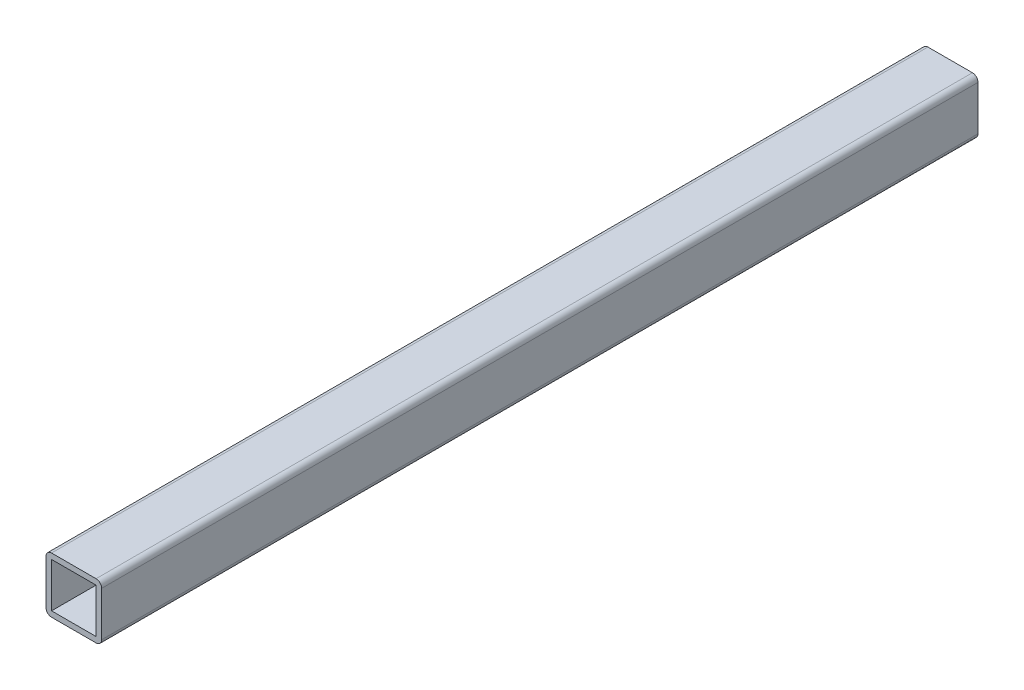
ISO-10303-21;
HEADER;
FILE_DESCRIPTION(('STEP AP214'),'2;1');
FILE_NAME('part.step','',(''),(''),'','','');
FILE_SCHEMA(('AUTOMOTIVE_DESIGN { 1 0 10303 214 1 1 1 1 }'));
ENDSEC;
DATA;
#1=APPLICATION_CONTEXT('core data for automotive mechanical design processes');
#2=APPLICATION_PROTOCOL_DEFINITION('international standard','automotive_design',2000,#1);
#3=PRODUCT_CONTEXT('',#1,'mechanical');
#4=PRODUCT('Part','Part','',(#3));
#5=PRODUCT_RELATED_PRODUCT_CATEGORY('part','',(#4));
#6=PRODUCT_DEFINITION_FORMATION('','',#4);
#7=PRODUCT_DEFINITION_CONTEXT('part definition',#1,'design');
#8=PRODUCT_DEFINITION('design','',#6,#7);
#9=PRODUCT_DEFINITION_SHAPE('','',#8);
#10=(LENGTH_UNIT() NAMED_UNIT(*) SI_UNIT(.MILLI.,.METRE.));
#11=(NAMED_UNIT(*) PLANE_ANGLE_UNIT() SI_UNIT($,.RADIAN.));
#12=(NAMED_UNIT(*) SI_UNIT($,.STERADIAN.) SOLID_ANGLE_UNIT());
#13=UNCERTAINTY_MEASURE_WITH_UNIT(LENGTH_MEASURE(1.E-05),#10,'distance_accuracy_value','');
#14=(GEOMETRIC_REPRESENTATION_CONTEXT(3) GLOBAL_UNCERTAINTY_ASSIGNED_CONTEXT((#13)) GLOBAL_UNIT_ASSIGNED_CONTEXT((#10,
#11,#12)) REPRESENTATION_CONTEXT('',''));
#15=CARTESIAN_POINT('',(0.,0.,0.));
#16=DIRECTION('',(0.,0.,1.));
#17=DIRECTION('',(1.,0.,0.));
#18=AXIS2_PLACEMENT_3D('',#15,#16,#17);
#19=CARTESIAN_POINT('',(-10.16,-10.16,400.));
#20=DIRECTION('',(0.,0.,1.));
#21=DIRECTION('',(1.,0.,0.));
#22=AXIS2_PLACEMENT_3D('',#19,#20,#21);
#23=PLANE('',#22);
#24=CARTESIAN_POINT('',(-10.16,-10.16,400.));
#25=DIRECTION('',(0.,0.,1.));
#26=DIRECTION('',(1.,0.,0.));
#27=AXIS2_PLACEMENT_3D('',#24,#25,#26);
#28=CIRCLE('',#27,2.54);
#29=CARTESIAN_POINT('',(-12.7,-10.16,400.));
#30=VERTEX_POINT('',#29);
#31=CARTESIAN_POINT('',(-10.16,-12.7,400.));
#32=VERTEX_POINT('',#31);
#33=EDGE_CURVE('E177',#30,#32,#28,.T.);
#34=ORIENTED_EDGE('',*,*,#33,.T.);
#35=DIRECTION('',(1.,0.,0.));
#36=VECTOR('',#35,1.);
#37=CARTESIAN_POINT('',(-10.16,-12.7,400.));
#38=LINE('',#37,#36);
#39=CARTESIAN_POINT('',(10.16,-12.7,400.));
#40=VERTEX_POINT('',#39);
#41=EDGE_CURVE('E181',#32,#40,#38,.T.);
#42=ORIENTED_EDGE('',*,*,#41,.T.);
#43=CARTESIAN_POINT('',(10.16,-10.16,400.));
#44=DIRECTION('',(0.,0.,1.));
#45=DIRECTION('',(1.,0.,0.));
#46=AXIS2_PLACEMENT_3D('',#43,#44,#45);
#47=CIRCLE('',#46,2.54);
#48=CARTESIAN_POINT('',(12.7,-10.16,400.));
#49=VERTEX_POINT('',#48);
#50=EDGE_CURVE('E185',#40,#49,#47,.T.);
#51=ORIENTED_EDGE('',*,*,#50,.T.);
#52=DIRECTION('',(0.,1.,0.));
#53=VECTOR('',#52,1.);
#54=CARTESIAN_POINT('',(12.7,10.16,400.));
#55=LINE('',#54,#53);
#56=CARTESIAN_POINT('',(12.7,10.16,400.));
#57=VERTEX_POINT('',#56);
#58=EDGE_CURVE('E188',#49,#57,#55,.T.);
#59=ORIENTED_EDGE('',*,*,#58,.T.);
#60=CARTESIAN_POINT('',(10.16,10.16,400.));
#61=DIRECTION('',(0.,0.,1.));
#62=DIRECTION('',(-1.,0.,0.));
#63=AXIS2_PLACEMENT_3D('',#60,#61,#62);
#64=CIRCLE('',#63,2.54);
#65=CARTESIAN_POINT('',(10.16,12.7,400.));
#66=VERTEX_POINT('',#65);
#67=EDGE_CURVE('E191',#57,#66,#64,.T.);
#68=ORIENTED_EDGE('',*,*,#67,.T.);
#69=DIRECTION('',(-1.,0.,0.));
#70=VECTOR('',#69,1.);
#71=CARTESIAN_POINT('',(-10.16,12.7,400.));
#72=LINE('',#71,#70);
#73=CARTESIAN_POINT('',(-10.16,12.7,400.));
#74=VERTEX_POINT('',#73);
#75=EDGE_CURVE('E194',#66,#74,#72,.T.);
#76=ORIENTED_EDGE('',*,*,#75,.T.);
#77=CARTESIAN_POINT('',(-10.16,10.16,400.));
#78=DIRECTION('',(0.,0.,1.));
#79=DIRECTION('',(-1.,0.,0.));
#80=AXIS2_PLACEMENT_3D('',#77,#78,#79);
#81=CIRCLE('',#80,2.54);
#82=CARTESIAN_POINT('',(-12.7,10.16,400.));
#83=VERTEX_POINT('',#82);
#84=EDGE_CURVE('E197',#74,#83,#81,.T.);
#85=ORIENTED_EDGE('',*,*,#84,.T.);
#86=DIRECTION('',(0.,-1.,0.));
#87=VECTOR('',#86,1.);
#88=CARTESIAN_POINT('',(-12.7,10.16,400.));
#89=LINE('',#88,#87);
#90=EDGE_CURVE('E200',#83,#30,#89,.T.);
#91=ORIENTED_EDGE('',*,*,#90,.T.);
#92=EDGE_LOOP('',(#34,#42,#51,#59,#68,#76,#85,#91));
#93=FACE_BOUND('',#92,.T.);
#94=DIRECTION('',(0.,-1.,0.));
#95=VECTOR('',#94,1.);
#96=CARTESIAN_POINT('',(-10.16,10.16,400.));
#97=LINE('',#96,#95);
#98=CARTESIAN_POINT('',(-10.16,10.16,400.));
#99=VERTEX_POINT('',#98);
#100=CARTESIAN_POINT('',(-10.16,-10.16,400.));
#101=VERTEX_POINT('',#100);
#102=EDGE_CURVE('E138',#99,#101,#97,.T.);
#103=ORIENTED_EDGE('',*,*,#102,.F.);
#104=DIRECTION('',(-1.,0.,0.));
#105=VECTOR('',#104,1.);
#106=CARTESIAN_POINT('',(-10.16,10.16,400.));
#107=LINE('',#106,#105);
#108=CARTESIAN_POINT('',(10.16,10.16,400.));
#109=VERTEX_POINT('',#108);
#110=EDGE_CURVE('E129',#109,#99,#107,.T.);
#111=ORIENTED_EDGE('',*,*,#110,.F.);
#112=DIRECTION('',(0.,1.,0.));
#113=VECTOR('',#112,1.);
#114=CARTESIAN_POINT('',(10.16,10.16,400.));
#115=LINE('',#114,#113);
#116=CARTESIAN_POINT('',(10.16,-10.16,400.));
#117=VERTEX_POINT('',#116);
#118=EDGE_CURVE('E155',#117,#109,#115,.T.);
#119=ORIENTED_EDGE('',*,*,#118,.F.);
#120=DIRECTION('',(1.,0.,0.));
#121=VECTOR('',#120,1.);
#122=CARTESIAN_POINT('',(-10.16,-10.16,400.));
#123=LINE('',#122,#121);
#124=EDGE_CURVE('E151',#101,#117,#123,.T.);
#125=ORIENTED_EDGE('',*,*,#124,.F.);
#126=EDGE_LOOP('',(#103,#111,#119,#125));
#127=FACE_BOUND('',#126,.T.);
#128=ADVANCED_FACE('F39',(#93,#127),#23,.T.);
#129=CARTESIAN_POINT('',(-10.16,-10.16,0.));
#130=DIRECTION('',(0.,0.,1.));
#131=DIRECTION('',(1.,0.,0.));
#132=AXIS2_PLACEMENT_3D('',#129,#130,#131);
#133=PLANE('',#132);
#134=CARTESIAN_POINT('',(-10.16,-10.16,0.));
#135=DIRECTION('',(0.,0.,1.));
#136=DIRECTION('',(1.,0.,0.));
#137=AXIS2_PLACEMENT_3D('',#134,#135,#136);
#138=CIRCLE('',#137,2.54);
#139=CARTESIAN_POINT('',(-12.7,-10.16,0.));
#140=VERTEX_POINT('',#139);
#141=CARTESIAN_POINT('',(-10.16,-12.7,0.));
#142=VERTEX_POINT('',#141);
#143=EDGE_CURVE('E147',#140,#142,#138,.T.);
#144=ORIENTED_EDGE('',*,*,#143,.F.);
#145=DIRECTION('',(0.,-1.,0.));
#146=VECTOR('',#145,1.);
#147=CARTESIAN_POINT('',(-12.7,10.16,0.));
#148=LINE('',#147,#146);
#149=CARTESIAN_POINT('',(-12.7,10.16,0.));
#150=VERTEX_POINT('',#149);
#151=EDGE_CURVE('E182',#150,#140,#148,.T.);
#152=ORIENTED_EDGE('',*,*,#151,.F.);
#153=CARTESIAN_POINT('',(-10.16,10.16,0.));
#154=DIRECTION('',(0.,0.,1.));
#155=DIRECTION('',(-1.,0.,0.));
#156=AXIS2_PLACEMENT_3D('',#153,#154,#155);
#157=CIRCLE('',#156,2.54);
#158=CARTESIAN_POINT('',(-10.16,12.7,0.));
#159=VERTEX_POINT('',#158);
#160=EDGE_CURVE('E222',#159,#150,#157,.T.);
#161=ORIENTED_EDGE('',*,*,#160,.F.);
#162=DIRECTION('',(-1.,0.,0.));
#163=VECTOR('',#162,1.);
#164=CARTESIAN_POINT('',(-10.16,12.7,0.));
#165=LINE('',#164,#163);
#166=CARTESIAN_POINT('',(10.16,12.7,0.));
#167=VERTEX_POINT('',#166);
#168=EDGE_CURVE('E219',#167,#159,#165,.T.);
#169=ORIENTED_EDGE('',*,*,#168,.F.);
#170=CARTESIAN_POINT('',(10.16,10.16,0.));
#171=DIRECTION('',(0.,0.,1.));
#172=DIRECTION('',(-1.,0.,0.));
#173=AXIS2_PLACEMENT_3D('',#170,#171,#172);
#174=CIRCLE('',#173,2.54);
#175=CARTESIAN_POINT('',(12.7,10.16,0.));
#176=VERTEX_POINT('',#175);
#177=EDGE_CURVE('E216',#176,#167,#174,.T.);
#178=ORIENTED_EDGE('',*,*,#177,.F.);
#179=DIRECTION('',(0.,1.,0.));
#180=VECTOR('',#179,1.);
#181=CARTESIAN_POINT('',(12.7,10.16,0.));
#182=LINE('',#181,#180);
#183=CARTESIAN_POINT('',(12.7,-10.16,0.));
#184=VERTEX_POINT('',#183);
#185=EDGE_CURVE('E213',#184,#176,#182,.T.);
#186=ORIENTED_EDGE('',*,*,#185,.F.);
#187=CARTESIAN_POINT('',(10.16,-10.16,0.));
#188=DIRECTION('',(0.,0.,1.));
#189=DIRECTION('',(1.,0.,0.));
#190=AXIS2_PLACEMENT_3D('',#187,#188,#189);
#191=CIRCLE('',#190,2.54);
#192=CARTESIAN_POINT('',(10.16,-12.7,0.));
#193=VERTEX_POINT('',#192);
#194=EDGE_CURVE('E210',#193,#184,#191,.T.);
#195=ORIENTED_EDGE('',*,*,#194,.F.);
#196=DIRECTION('',(1.,0.,0.));
#197=VECTOR('',#196,1.);
#198=CARTESIAN_POINT('',(-10.16,-12.7,0.));
#199=LINE('',#198,#197);
#200=EDGE_CURVE('E207',#142,#193,#199,.T.);
#201=ORIENTED_EDGE('',*,*,#200,.F.);
#202=EDGE_LOOP('',(#144,#152,#161,#169,#178,#186,#195,#201));
#203=FACE_BOUND('',#202,.T.);
#204=DIRECTION('',(-1.,0.,0.));
#205=VECTOR('',#204,1.);
#206=CARTESIAN_POINT('',(-10.16,10.16,0.));
#207=LINE('',#206,#205);
#208=CARTESIAN_POINT('',(10.16,10.16,0.));
#209=VERTEX_POINT('',#208);
#210=CARTESIAN_POINT('',(-10.16,10.16,0.));
#211=VERTEX_POINT('',#210);
#212=EDGE_CURVE('E63',#209,#211,#207,.T.);
#213=ORIENTED_EDGE('',*,*,#212,.T.);
#214=DIRECTION('',(0.,-1.,0.));
#215=VECTOR('',#214,1.);
#216=CARTESIAN_POINT('',(-10.16,10.16,0.));
#217=LINE('',#216,#215);
#218=CARTESIAN_POINT('',(-10.16,-10.16,0.));
#219=VERTEX_POINT('',#218);
#220=EDGE_CURVE('E145',#211,#219,#217,.T.);
#221=ORIENTED_EDGE('',*,*,#220,.T.);
#222=DIRECTION('',(1.,0.,0.));
#223=VECTOR('',#222,1.);
#224=CARTESIAN_POINT('',(-10.16,-10.16,0.));
#225=LINE('',#224,#223);
#226=CARTESIAN_POINT('',(10.16,-10.16,0.));
#227=VERTEX_POINT('',#226);
#228=EDGE_CURVE('E164',#219,#227,#225,.T.);
#229=ORIENTED_EDGE('',*,*,#228,.T.);
#230=DIRECTION('',(0.,1.,0.));
#231=VECTOR('',#230,1.);
#232=CARTESIAN_POINT('',(10.16,10.16,0.));
#233=LINE('',#232,#231);
#234=EDGE_CURVE('E139',#227,#209,#233,.T.);
#235=ORIENTED_EDGE('',*,*,#234,.T.);
#236=EDGE_LOOP('',(#213,#221,#229,#235));
#237=FACE_BOUND('',#236,.T.);
#238=ADVANCED_FACE('F261',(#203,#237),#133,.F.);
#239=CARTESIAN_POINT('',(-10.16,-10.16,400.));
#240=DIRECTION('',(0.,0.,-1.));
#241=DIRECTION('',(-1.,0.,0.));
#242=AXIS2_PLACEMENT_3D('',#239,#240,#241);
#243=CYLINDRICAL_SURFACE('',#242,2.54);
#244=ORIENTED_EDGE('',*,*,#143,.T.);
#245=DIRECTION('',(0.,0.,-1.));
#246=VECTOR('',#245,1.);
#247=CARTESIAN_POINT('',(-10.16,-12.7,400.));
#248=LINE('',#247,#246);
#249=EDGE_CURVE('E11',#32,#142,#248,.T.);
#250=ORIENTED_EDGE('',*,*,#249,.F.);
#251=ORIENTED_EDGE('',*,*,#33,.F.);
#252=DIRECTION('',(0.,0.,-1.));
#253=VECTOR('',#252,1.);
#254=CARTESIAN_POINT('',(-12.7,-10.16,400.));
#255=LINE('',#254,#253);
#256=EDGE_CURVE('E203',#30,#140,#255,.T.);
#257=ORIENTED_EDGE('',*,*,#256,.T.);
#258=EDGE_LOOP('',(#244,#250,#251,#257));
#259=FACE_BOUND('',#258,.T.);
#260=ADVANCED_FACE('F41',(#259),#243,.T.);
#261=CARTESIAN_POINT('',(-10.16,-12.7,400.));
#262=DIRECTION('',(0.,1.,0.));
#263=DIRECTION('',(0.,0.,1.));
#264=AXIS2_PLACEMENT_3D('',#261,#262,#263);
#265=PLANE('',#264);
#266=ORIENTED_EDGE('',*,*,#200,.T.);
#267=DIRECTION('',(0.,0.,-1.));
#268=VECTOR('',#267,1.);
#269=CARTESIAN_POINT('',(10.16,-12.7,400.));
#270=LINE('',#269,#268);
#271=EDGE_CURVE('E48',#40,#193,#270,.T.);
#272=ORIENTED_EDGE('',*,*,#271,.F.);
#273=ORIENTED_EDGE('',*,*,#41,.F.);
#274=ORIENTED_EDGE('',*,*,#249,.T.);
#275=EDGE_LOOP('',(#266,#272,#273,#274));
#276=FACE_BOUND('',#275,.T.);
#277=ADVANCED_FACE('F278',(#276),#265,.F.);
#278=CARTESIAN_POINT('',(10.16,-10.16,400.));
#279=DIRECTION('',(0.,0.,-1.));
#280=DIRECTION('',(-1.,0.,0.));
#281=AXIS2_PLACEMENT_3D('',#278,#279,#280);
#282=CYLINDRICAL_SURFACE('',#281,2.54);
#283=ORIENTED_EDGE('',*,*,#194,.T.);
#284=DIRECTION('',(0.,0.,-1.));
#285=VECTOR('',#284,1.);
#286=CARTESIAN_POINT('',(12.7,-10.16,400.));
#287=LINE('',#286,#285);
#288=EDGE_CURVE('E246',#49,#184,#287,.T.);
#289=ORIENTED_EDGE('',*,*,#288,.F.);
#290=ORIENTED_EDGE('',*,*,#50,.F.);
#291=ORIENTED_EDGE('',*,*,#271,.T.);
#292=EDGE_LOOP('',(#283,#289,#290,#291));
#293=FACE_BOUND('',#292,.T.);
#294=ADVANCED_FACE('F255',(#293),#282,.T.);
#295=CARTESIAN_POINT('',(12.7,10.16,400.));
#296=DIRECTION('',(-1.,0.,0.));
#297=DIRECTION('',(0.,-1.,0.));
#298=AXIS2_PLACEMENT_3D('',#295,#296,#297);
#299=PLANE('',#298);
#300=ORIENTED_EDGE('',*,*,#185,.T.);
#301=DIRECTION('',(0.,0.,-1.));
#302=VECTOR('',#301,1.);
#303=CARTESIAN_POINT('',(12.7,10.16,400.));
#304=LINE('',#303,#302);
#305=EDGE_CURVE('E242',#57,#176,#304,.T.);
#306=ORIENTED_EDGE('',*,*,#305,.F.);
#307=ORIENTED_EDGE('',*,*,#58,.F.);
#308=ORIENTED_EDGE('',*,*,#288,.T.);
#309=EDGE_LOOP('',(#300,#306,#307,#308));
#310=FACE_BOUND('',#309,.T.);
#311=ADVANCED_FACE('F267',(#310),#299,.F.);
#312=CARTESIAN_POINT('',(10.16,10.16,400.));
#313=DIRECTION('',(0.,0.,-1.));
#314=DIRECTION('',(-1.,0.,0.));
#315=AXIS2_PLACEMENT_3D('',#312,#313,#314);
#316=CYLINDRICAL_SURFACE('',#315,2.54);
#317=ORIENTED_EDGE('',*,*,#177,.T.);
#318=DIRECTION('',(0.,0.,-1.));
#319=VECTOR('',#318,1.);
#320=CARTESIAN_POINT('',(10.16,12.7,400.));
#321=LINE('',#320,#319);
#322=EDGE_CURVE('E238',#66,#167,#321,.T.);
#323=ORIENTED_EDGE('',*,*,#322,.F.);
#324=ORIENTED_EDGE('',*,*,#67,.F.);
#325=ORIENTED_EDGE('',*,*,#305,.T.);
#326=EDGE_LOOP('',(#317,#323,#324,#325));
#327=FACE_BOUND('',#326,.T.);
#328=ADVANCED_FACE('F271',(#327),#316,.T.);
#329=CARTESIAN_POINT('',(-10.16,12.7,400.));
#330=DIRECTION('',(0.,-1.,0.));
#331=DIRECTION('',(0.,0.,-1.));
#332=AXIS2_PLACEMENT_3D('',#329,#330,#331);
#333=PLANE('',#332);
#334=ORIENTED_EDGE('',*,*,#168,.T.);
#335=DIRECTION('',(0.,0.,-1.));
#336=VECTOR('',#335,1.);
#337=CARTESIAN_POINT('',(-10.16,12.7,400.));
#338=LINE('',#337,#336);
#339=EDGE_CURVE('E234',#74,#159,#338,.T.);
#340=ORIENTED_EDGE('',*,*,#339,.F.);
#341=ORIENTED_EDGE('',*,*,#75,.F.);
#342=ORIENTED_EDGE('',*,*,#322,.T.);
#343=EDGE_LOOP('',(#334,#340,#341,#342));
#344=FACE_BOUND('',#343,.T.);
#345=ADVANCED_FACE('F291',(#344),#333,.F.);
#346=CARTESIAN_POINT('',(-10.16,10.16,400.));
#347=DIRECTION('',(0.,0.,-1.));
#348=DIRECTION('',(-1.,0.,0.));
#349=AXIS2_PLACEMENT_3D('',#346,#347,#348);
#350=CYLINDRICAL_SURFACE('',#349,2.54);
#351=ORIENTED_EDGE('',*,*,#160,.T.);
#352=DIRECTION('',(0.,0.,-1.));
#353=VECTOR('',#352,1.);
#354=CARTESIAN_POINT('',(-12.7,10.16,400.));
#355=LINE('',#354,#353);
#356=EDGE_CURVE('E230',#83,#150,#355,.T.);
#357=ORIENTED_EDGE('',*,*,#356,.F.);
#358=ORIENTED_EDGE('',*,*,#84,.F.);
#359=ORIENTED_EDGE('',*,*,#339,.T.);
#360=EDGE_LOOP('',(#351,#357,#358,#359));
#361=FACE_BOUND('',#360,.T.);
#362=ADVANCED_FACE('F289',(#361),#350,.T.);
#363=CARTESIAN_POINT('',(-12.7,10.16,400.));
#364=DIRECTION('',(1.,0.,0.));
#365=DIRECTION('',(0.,1.,0.));
#366=AXIS2_PLACEMENT_3D('',#363,#364,#365);
#367=PLANE('',#366);
#368=ORIENTED_EDGE('',*,*,#151,.T.);
#369=ORIENTED_EDGE('',*,*,#256,.F.);
#370=ORIENTED_EDGE('',*,*,#90,.F.);
#371=ORIENTED_EDGE('',*,*,#356,.T.);
#372=EDGE_LOOP('',(#368,#369,#370,#371));
#373=FACE_BOUND('',#372,.T.);
#374=ADVANCED_FACE('F284',(#373),#367,.F.);
#375=CARTESIAN_POINT('',(-10.16,10.16,400.));
#376=DIRECTION('',(0.,-1.,0.));
#377=DIRECTION('',(0.,0.,-1.));
#378=AXIS2_PLACEMENT_3D('',#375,#376,#377);
#379=PLANE('',#378);
#380=ORIENTED_EDGE('',*,*,#212,.F.);
#381=DIRECTION('',(0.,0.,-1.));
#382=VECTOR('',#381,1.);
#383=CARTESIAN_POINT('',(10.16,10.16,400.));
#384=LINE('',#383,#382);
#385=EDGE_CURVE('E133',#109,#209,#384,.T.);
#386=ORIENTED_EDGE('',*,*,#385,.F.);
#387=ORIENTED_EDGE('',*,*,#110,.T.);
#388=DIRECTION('',(0.,0.,-1.));
#389=VECTOR('',#388,1.);
#390=CARTESIAN_POINT('',(-10.16,10.16,400.));
#391=LINE('',#390,#389);
#392=EDGE_CURVE('E132',#99,#211,#391,.T.);
#393=ORIENTED_EDGE('',*,*,#392,.T.);
#394=EDGE_LOOP('',(#380,#386,#387,#393));
#395=FACE_BOUND('',#394,.T.);
#396=ADVANCED_FACE('F131',(#395),#379,.T.);
#397=CARTESIAN_POINT('',(-10.16,10.16,400.));
#398=DIRECTION('',(1.,0.,0.));
#399=DIRECTION('',(0.,1.,0.));
#400=AXIS2_PLACEMENT_3D('',#397,#398,#399);
#401=PLANE('',#400);
#402=ORIENTED_EDGE('',*,*,#220,.F.);
#403=ORIENTED_EDGE('',*,*,#392,.F.);
#404=ORIENTED_EDGE('',*,*,#102,.T.);
#405=DIRECTION('',(0.,0.,-1.));
#406=VECTOR('',#405,1.);
#407=CARTESIAN_POINT('',(-10.16,-10.16,400.));
#408=LINE('',#407,#406);
#409=EDGE_CURVE('E148',#101,#219,#408,.T.);
#410=ORIENTED_EDGE('',*,*,#409,.T.);
#411=EDGE_LOOP('',(#402,#403,#404,#410));
#412=FACE_BOUND('',#411,.T.);
#413=ADVANCED_FACE('F142',(#412),#401,.T.);
#414=CARTESIAN_POINT('',(-10.16,-10.16,400.));
#415=DIRECTION('',(0.,1.,0.));
#416=DIRECTION('',(0.,0.,1.));
#417=AXIS2_PLACEMENT_3D('',#414,#415,#416);
#418=PLANE('',#417);
#419=ORIENTED_EDGE('',*,*,#228,.F.);
#420=ORIENTED_EDGE('',*,*,#409,.F.);
#421=ORIENTED_EDGE('',*,*,#124,.T.);
#422=DIRECTION('',(0.,0.,-1.));
#423=VECTOR('',#422,1.);
#424=CARTESIAN_POINT('',(10.16,-10.16,400.));
#425=LINE('',#424,#423);
#426=EDGE_CURVE('E55',#117,#227,#425,.T.);
#427=ORIENTED_EDGE('',*,*,#426,.T.);
#428=EDGE_LOOP('',(#419,#420,#421,#427));
#429=FACE_BOUND('',#428,.T.);
#430=ADVANCED_FACE('F316',(#429),#418,.T.);
#431=CARTESIAN_POINT('',(10.16,10.16,400.));
#432=DIRECTION('',(-1.,0.,0.));
#433=DIRECTION('',(0.,-1.,0.));
#434=AXIS2_PLACEMENT_3D('',#431,#432,#433);
#435=PLANE('',#434);
#436=ORIENTED_EDGE('',*,*,#234,.F.);
#437=ORIENTED_EDGE('',*,*,#426,.F.);
#438=ORIENTED_EDGE('',*,*,#118,.T.);
#439=ORIENTED_EDGE('',*,*,#385,.T.);
#440=EDGE_LOOP('',(#436,#437,#438,#439));
#441=FACE_BOUND('',#440,.T.);
#442=ADVANCED_FACE('F320',(#441),#435,.T.);
#443=CLOSED_SHELL('',(#128,#238,#260,#277,#294,#311,#328,#345,#362,#374,#396,#413,#430,#442));
#444=MANIFOLD_SOLID_BREP('B2',#443);
#445=ADVANCED_BREP_SHAPE_REPRESENTATION('',(#18,#444),#14);
#446=SHAPE_DEFINITION_REPRESENTATION(#9,#445);
ENDSEC;
END-ISO-10303-21;
